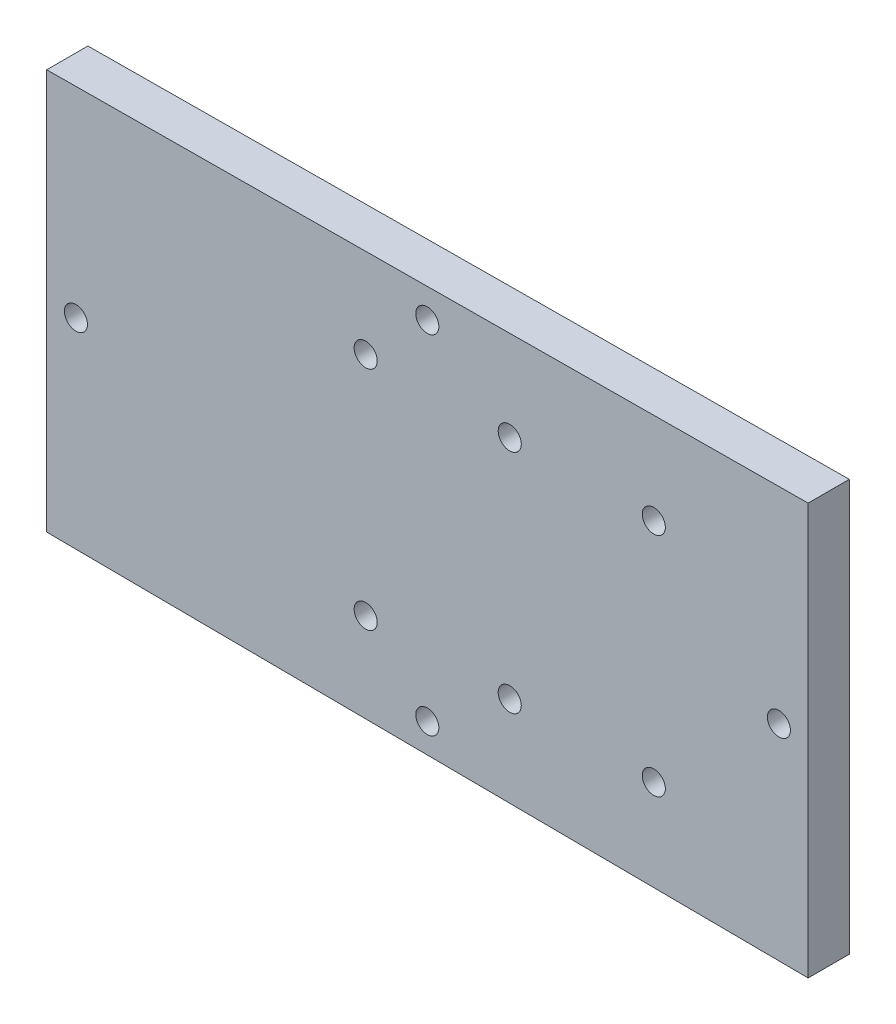
ISO-10303-21;
HEADER;
FILE_DESCRIPTION(('STEP AP214'),'2;1');
FILE_NAME('part.step','',(''),(''),'','','');
FILE_SCHEMA(('AUTOMOTIVE_DESIGN { 1 0 10303 214 1 1 1 1 }'));
ENDSEC;
DATA;
#1=APPLICATION_CONTEXT('core data for automotive mechanical design processes');
#2=APPLICATION_PROTOCOL_DEFINITION('international standard','automotive_design',2000,#1);
#3=PRODUCT_CONTEXT('',#1,'mechanical');
#4=PRODUCT('Part','Part','',(#3));
#5=PRODUCT_RELATED_PRODUCT_CATEGORY('part','',(#4));
#6=PRODUCT_DEFINITION_FORMATION('','',#4);
#7=PRODUCT_DEFINITION_CONTEXT('part definition',#1,'design');
#8=PRODUCT_DEFINITION('design','',#6,#7);
#9=PRODUCT_DEFINITION_SHAPE('','',#8);
#10=(LENGTH_UNIT() NAMED_UNIT(*) SI_UNIT(.MILLI.,.METRE.));
#11=(NAMED_UNIT(*) PLANE_ANGLE_UNIT() SI_UNIT($,.RADIAN.));
#12=(NAMED_UNIT(*) SI_UNIT($,.STERADIAN.) SOLID_ANGLE_UNIT());
#13=UNCERTAINTY_MEASURE_WITH_UNIT(LENGTH_MEASURE(1.E-05),#10,'distance_accuracy_value','');
#14=(GEOMETRIC_REPRESENTATION_CONTEXT(3) GLOBAL_UNCERTAINTY_ASSIGNED_CONTEXT((#13)) GLOBAL_UNIT_ASSIGNED_CONTEXT((#10,
#11,#12)) REPRESENTATION_CONTEXT('',''));
#15=CARTESIAN_POINT('',(0.,0.,0.));
#16=DIRECTION('',(0.,0.,1.));
#17=DIRECTION('',(1.,0.,0.));
#18=AXIS2_PLACEMENT_3D('',#15,#16,#17);
#19=CARTESIAN_POINT('',(0.,126.90875376903,25.4));
#20=DIRECTION('',(0.00713366924881035,-0.999974555057802,0.));
#21=DIRECTION('',(0.999974555057802,0.00713366924881035,0.));
#22=AXIS2_PLACEMENT_3D('',#19,#20,#21);
#23=PLANE('',#22);
#24=DIRECTION('',(-0.999974555057802,-0.00713366924881035,0.));
#25=VECTOR('',#24,1.);
#26=CARTESIAN_POINT('',(0.,126.90875376903,0.));
#27=LINE('',#26,#25);
#28=CARTESIAN_POINT('',(0.,126.90875376903,0.));
#29=VERTEX_POINT('',#28);
#30=CARTESIAN_POINT('',(-469.9,123.556557292569,0.));
#31=VERTEX_POINT('',#30);
#32=EDGE_CURVE('E101',#29,#31,#27,.T.);
#33=ORIENTED_EDGE('',*,*,#32,.T.);
#34=DIRECTION('',(0.,0.,-1.));
#35=VECTOR('',#34,1.);
#36=CARTESIAN_POINT('',(-469.9,123.556557292569,25.4));
#37=LINE('',#36,#35);
#38=CARTESIAN_POINT('',(-469.9,123.556557292569,25.4));
#39=VERTEX_POINT('',#38);
#40=EDGE_CURVE('E11',#39,#31,#37,.T.);
#41=ORIENTED_EDGE('',*,*,#40,.F.);
#42=DIRECTION('',(-0.999974555057802,-0.00713366924881035,0.));
#43=VECTOR('',#42,1.);
#44=CARTESIAN_POINT('',(0.,126.90875376903,25.4));
#45=LINE('',#44,#43);
#46=CARTESIAN_POINT('',(0.,126.90875376903,25.4));
#47=VERTEX_POINT('',#46);
#48=EDGE_CURVE('E87',#47,#39,#45,.T.);
#49=ORIENTED_EDGE('',*,*,#48,.F.);
#50=DIRECTION('',(0.,0.,-1.));
#51=VECTOR('',#50,1.);
#52=CARTESIAN_POINT('',(0.,126.90875376903,25.4));
#53=LINE('',#52,#51);
#54=EDGE_CURVE('E54',#47,#29,#53,.T.);
#55=ORIENTED_EDGE('',*,*,#54,.T.);
#56=EDGE_LOOP('',(#33,#41,#49,#55));
#57=FACE_BOUND('',#56,.T.);
#58=ADVANCED_FACE('F38',(#57),#23,.F.);
#59=CARTESIAN_POINT('',(-469.9,123.556557292569,25.4));
#60=DIRECTION('',(1.,0.,0.));
#61=DIRECTION('',(0.,1.,0.));
#62=AXIS2_PLACEMENT_3D('',#59,#60,#61);
#63=PLANE('',#62);
#64=DIRECTION('',(0.,-1.,0.));
#65=VECTOR('',#64,1.);
#66=CARTESIAN_POINT('',(-469.9,123.556557292569,0.));
#67=LINE('',#66,#65);
#68=CARTESIAN_POINT('',(-469.9,-123.556557292569,0.));
#69=VERTEX_POINT('',#68);
#70=EDGE_CURVE('E92',#31,#69,#67,.T.);
#71=ORIENTED_EDGE('',*,*,#70,.T.);
#72=DIRECTION('',(0.,0.,-1.));
#73=VECTOR('',#72,1.);
#74=CARTESIAN_POINT('',(-469.9,-123.556557292569,25.4));
#75=LINE('',#74,#73);
#76=CARTESIAN_POINT('',(-469.9,-123.556557292569,25.4));
#77=VERTEX_POINT('',#76);
#78=EDGE_CURVE('E46',#77,#69,#75,.T.);
#79=ORIENTED_EDGE('',*,*,#78,.F.);
#80=DIRECTION('',(0.,-1.,0.));
#81=VECTOR('',#80,1.);
#82=CARTESIAN_POINT('',(-469.9,123.556557292569,25.4));
#83=LINE('',#82,#81);
#84=EDGE_CURVE('E79',#39,#77,#83,.T.);
#85=ORIENTED_EDGE('',*,*,#84,.F.);
#86=ORIENTED_EDGE('',*,*,#40,.T.);
#87=EDGE_LOOP('',(#71,#79,#85,#86));
#88=FACE_BOUND('',#87,.T.);
#89=ADVANCED_FACE('F91',(#88),#63,.F.);
#90=CARTESIAN_POINT('',(0.,-126.90875376903,25.4));
#91=DIRECTION('',(-0.00713366924880988,-0.999974555057802,0.));
#92=DIRECTION('',(0.999974555057802,-0.00713366924880988,0.));
#93=AXIS2_PLACEMENT_3D('',#90,#91,#92);
#94=PLANE('',#93);
#95=DIRECTION('',(-0.999974555057802,0.00713366924880988,0.));
#96=VECTOR('',#95,1.);
#97=CARTESIAN_POINT('',(0.,-126.90875376903,0.));
#98=LINE('',#97,#96);
#99=CARTESIAN_POINT('',(0.,-126.90875376903,0.));
#100=VERTEX_POINT('',#99);
#101=EDGE_CURVE('E105',#100,#69,#98,.T.);
#102=ORIENTED_EDGE('',*,*,#101,.F.);
#103=DIRECTION('',(0.,0.,-1.));
#104=VECTOR('',#103,1.);
#105=CARTESIAN_POINT('',(0.,-126.90875376903,25.4));
#106=LINE('',#105,#104);
#107=CARTESIAN_POINT('',(0.,-126.90875376903,25.4));
#108=VERTEX_POINT('',#107);
#109=EDGE_CURVE('E68',#108,#100,#106,.T.);
#110=ORIENTED_EDGE('',*,*,#109,.F.);
#111=DIRECTION('',(-0.999974555057802,0.00713366924880988,0.));
#112=VECTOR('',#111,1.);
#113=CARTESIAN_POINT('',(0.,-126.90875376903,25.4));
#114=LINE('',#113,#112);
#115=EDGE_CURVE('E86',#108,#77,#114,.T.);
#116=ORIENTED_EDGE('',*,*,#115,.T.);
#117=ORIENTED_EDGE('',*,*,#78,.T.);
#118=EDGE_LOOP('',(#102,#110,#116,#117));
#119=FACE_BOUND('',#118,.T.);
#120=ADVANCED_FACE('F95',(#119),#94,.T.);
#121=CARTESIAN_POINT('',(0.,126.90875376903,25.4));
#122=DIRECTION('',(1.,0.,0.));
#123=DIRECTION('',(0.,1.,0.));
#124=AXIS2_PLACEMENT_3D('',#121,#122,#123);
#125=PLANE('',#124);
#126=DIRECTION('',(0.,-1.,0.));
#127=VECTOR('',#126,1.);
#128=CARTESIAN_POINT('',(0.,126.90875376903,0.));
#129=LINE('',#128,#127);
#130=EDGE_CURVE('E107',#29,#100,#129,.T.);
#131=ORIENTED_EDGE('',*,*,#130,.F.);
#132=ORIENTED_EDGE('',*,*,#54,.F.);
#133=DIRECTION('',(0.,-1.,0.));
#134=VECTOR('',#133,1.);
#135=CARTESIAN_POINT('',(0.,126.90875376903,25.4));
#136=LINE('',#135,#134);
#137=EDGE_CURVE('E96',#47,#108,#136,.T.);
#138=ORIENTED_EDGE('',*,*,#137,.T.);
#139=ORIENTED_EDGE('',*,*,#109,.T.);
#140=EDGE_LOOP('',(#131,#132,#138,#139));
#141=FACE_BOUND('',#140,.T.);
#142=ADVANCED_FACE('F179',(#141),#125,.T.);
#143=CARTESIAN_POINT('',(0.,0.,25.4));
#144=DIRECTION('',(0.,0.,1.));
#145=DIRECTION('',(1.,0.,0.));
#146=AXIS2_PLACEMENT_3D('',#143,#144,#145);
#147=PLANE('',#146);
#148=CARTESIAN_POINT('',(-95.2499999999999,69.85,25.4));
#149=DIRECTION('',(0.,0.,1.));
#150=DIRECTION('',(1.,0.,0.));
#151=AXIS2_PLACEMENT_3D('',#148,#149,#150);
#152=CIRCLE('',#151,7.1247);
#153=CARTESIAN_POINT('',(-88.1252999999999,69.85,25.4));
#154=VERTEX_POINT('',#153);
#155=EDGE_CURVE('E164',#154,#154,#152,.T.);
#156=ORIENTED_EDGE('',*,*,#155,.F.);
#157=EDGE_LOOP('',(#156));
#158=FACE_BOUND('',#157,.T.);
#159=CARTESIAN_POINT('',(-184.15,69.85,25.4));
#160=DIRECTION('',(0.,0.,1.));
#161=DIRECTION('',(1.,0.,0.));
#162=AXIS2_PLACEMENT_3D('',#159,#160,#161);
#163=CIRCLE('',#162,7.1247);
#164=CARTESIAN_POINT('',(-177.0253,69.85,25.4));
#165=VERTEX_POINT('',#164);
#166=EDGE_CURVE('E158',#165,#165,#163,.T.);
#167=ORIENTED_EDGE('',*,*,#166,.F.);
#168=EDGE_LOOP('',(#167));
#169=FACE_BOUND('',#168,.T.);
#170=CARTESIAN_POINT('',(-273.05,69.85,25.4));
#171=DIRECTION('',(0.,0.,1.));
#172=DIRECTION('',(1.,0.,0.));
#173=AXIS2_PLACEMENT_3D('',#170,#171,#172);
#174=CIRCLE('',#173,7.1247);
#175=CARTESIAN_POINT('',(-265.9253,69.85,25.4));
#176=VERTEX_POINT('',#175);
#177=EDGE_CURVE('E152',#176,#176,#174,.T.);
#178=ORIENTED_EDGE('',*,*,#177,.F.);
#179=EDGE_LOOP('',(#178));
#180=FACE_BOUND('',#179,.T.);
#181=CARTESIAN_POINT('',(-95.2499999999999,-69.85,25.4));
#182=DIRECTION('',(0.,0.,1.));
#183=DIRECTION('',(1.,0.,0.));
#184=AXIS2_PLACEMENT_3D('',#181,#182,#183);
#185=CIRCLE('',#184,7.1247);
#186=CARTESIAN_POINT('',(-88.1252999999999,-69.85,25.4));
#187=VERTEX_POINT('',#186);
#188=EDGE_CURVE('E146',#187,#187,#185,.T.);
#189=ORIENTED_EDGE('',*,*,#188,.F.);
#190=EDGE_LOOP('',(#189));
#191=FACE_BOUND('',#190,.T.);
#192=CARTESIAN_POINT('',(-184.15,-69.85,25.4));
#193=DIRECTION('',(0.,0.,1.));
#194=DIRECTION('',(1.,0.,0.));
#195=AXIS2_PLACEMENT_3D('',#192,#193,#194);
#196=CIRCLE('',#195,7.12470000000003);
#197=CARTESIAN_POINT('',(-177.0253,-69.85,25.4));
#198=VERTEX_POINT('',#197);
#199=EDGE_CURVE('E140',#198,#198,#196,.T.);
#200=ORIENTED_EDGE('',*,*,#199,.F.);
#201=EDGE_LOOP('',(#200));
#202=FACE_BOUND('',#201,.T.);
#203=CARTESIAN_POINT('',(-273.05,-69.85,25.4));
#204=DIRECTION('',(0.,0.,1.));
#205=DIRECTION('',(1.,0.,0.));
#206=AXIS2_PLACEMENT_3D('',#203,#204,#205);
#207=CIRCLE('',#206,7.1247);
#208=CARTESIAN_POINT('',(-265.9253,-69.85,25.4));
#209=VERTEX_POINT('',#208);
#210=EDGE_CURVE('E134',#209,#209,#207,.T.);
#211=ORIENTED_EDGE('',*,*,#210,.F.);
#212=EDGE_LOOP('',(#211));
#213=FACE_BOUND('',#212,.T.);
#214=CARTESIAN_POINT('',(-235.026595281803,-107.200076916086,25.4));
#215=DIRECTION('',(0.,0.,1.));
#216=DIRECTION('',(1.,0.,0.));
#217=AXIS2_PLACEMENT_3D('',#214,#215,#216);
#218=CIRCLE('',#217,7.1247);
#219=CARTESIAN_POINT('',(-227.901895281803,-107.200076916086,25.4));
#220=VERTEX_POINT('',#219);
#221=EDGE_CURVE('E128',#220,#220,#218,.T.);
#222=ORIENTED_EDGE('',*,*,#221,.F.);
#223=EDGE_LOOP('',(#222));
#224=FACE_BOUND('',#223,.T.);
#225=CARTESIAN_POINT('',(-451.866,0.,25.4));
#226=DIRECTION('',(0.,0.,1.));
#227=DIRECTION('',(1.,0.,0.));
#228=AXIS2_PLACEMENT_3D('',#225,#226,#227);
#229=CIRCLE('',#228,7.1247);
#230=CARTESIAN_POINT('',(-444.7413,0.,25.4));
#231=VERTEX_POINT('',#230);
#232=EDGE_CURVE('E122',#231,#231,#229,.T.);
#233=ORIENTED_EDGE('',*,*,#232,.F.);
#234=EDGE_LOOP('',(#233));
#235=FACE_BOUND('',#234,.T.);
#236=CARTESIAN_POINT('',(-18.034,0.,25.4));
#237=DIRECTION('',(0.,0.,1.));
#238=DIRECTION('',(1.,0.,0.));
#239=AXIS2_PLACEMENT_3D('',#236,#237,#238);
#240=CIRCLE('',#239,7.1247);
#241=CARTESIAN_POINT('',(-10.9093,0.,25.4));
#242=VERTEX_POINT('',#241);
#243=EDGE_CURVE('E116',#242,#242,#240,.T.);
#244=ORIENTED_EDGE('',*,*,#243,.F.);
#245=EDGE_LOOP('',(#244));
#246=FACE_BOUND('',#245,.T.);
#247=CARTESIAN_POINT('',(-235.026595281803,107.199301857,25.4));
#248=DIRECTION('',(0.,0.,1.));
#249=DIRECTION('',(1.,0.,0.));
#250=AXIS2_PLACEMENT_3D('',#247,#248,#249);
#251=CIRCLE('',#250,7.1247);
#252=CARTESIAN_POINT('',(-227.901895281803,107.199301857,25.4));
#253=VERTEX_POINT('',#252);
#254=EDGE_CURVE('E103',#253,#253,#251,.T.);
#255=ORIENTED_EDGE('',*,*,#254,.F.);
#256=EDGE_LOOP('',(#255));
#257=FACE_BOUND('',#256,.T.);
#258=ORIENTED_EDGE('',*,*,#48,.T.);
#259=ORIENTED_EDGE('',*,*,#84,.T.);
#260=ORIENTED_EDGE('',*,*,#115,.F.);
#261=ORIENTED_EDGE('',*,*,#137,.F.);
#262=EDGE_LOOP('',(#258,#259,#260,#261));
#263=FACE_BOUND('',#262,.T.);
#264=ADVANCED_FACE('F83',(#158,#169,#180,#191,#202,#213,#224,#235,#246,#257,#263),#147,.T.);
#265=CARTESIAN_POINT('',(0.,0.,0.));
#266=DIRECTION('',(0.,0.,1.));
#267=DIRECTION('',(1.,0.,0.));
#268=AXIS2_PLACEMENT_3D('',#265,#266,#267);
#269=PLANE('',#268);
#270=CARTESIAN_POINT('',(-95.2499999999999,69.85,0.));
#271=DIRECTION('',(0.,0.,1.));
#272=DIRECTION('',(1.,0.,0.));
#273=AXIS2_PLACEMENT_3D('',#270,#271,#272);
#274=CIRCLE('',#273,7.1247);
#275=CARTESIAN_POINT('',(-88.1252999999999,69.85,0.));
#276=VERTEX_POINT('',#275);
#277=EDGE_CURVE('E167',#276,#276,#274,.T.);
#278=ORIENTED_EDGE('',*,*,#277,.T.);
#279=EDGE_LOOP('',(#278));
#280=FACE_BOUND('',#279,.T.);
#281=CARTESIAN_POINT('',(-184.15,69.85,0.));
#282=DIRECTION('',(0.,0.,1.));
#283=DIRECTION('',(1.,0.,0.));
#284=AXIS2_PLACEMENT_3D('',#281,#282,#283);
#285=CIRCLE('',#284,7.1247);
#286=CARTESIAN_POINT('',(-177.0253,69.85,0.));
#287=VERTEX_POINT('',#286);
#288=EDGE_CURVE('E161',#287,#287,#285,.T.);
#289=ORIENTED_EDGE('',*,*,#288,.T.);
#290=EDGE_LOOP('',(#289));
#291=FACE_BOUND('',#290,.T.);
#292=CARTESIAN_POINT('',(-273.05,69.85,0.));
#293=DIRECTION('',(0.,0.,1.));
#294=DIRECTION('',(1.,0.,0.));
#295=AXIS2_PLACEMENT_3D('',#292,#293,#294);
#296=CIRCLE('',#295,7.1247);
#297=CARTESIAN_POINT('',(-265.9253,69.85,0.));
#298=VERTEX_POINT('',#297);
#299=EDGE_CURVE('E155',#298,#298,#296,.T.);
#300=ORIENTED_EDGE('',*,*,#299,.T.);
#301=EDGE_LOOP('',(#300));
#302=FACE_BOUND('',#301,.T.);
#303=CARTESIAN_POINT('',(-95.2499999999999,-69.85,0.));
#304=DIRECTION('',(0.,0.,1.));
#305=DIRECTION('',(1.,0.,0.));
#306=AXIS2_PLACEMENT_3D('',#303,#304,#305);
#307=CIRCLE('',#306,7.1247);
#308=CARTESIAN_POINT('',(-88.1252999999999,-69.85,0.));
#309=VERTEX_POINT('',#308);
#310=EDGE_CURVE('E149',#309,#309,#307,.T.);
#311=ORIENTED_EDGE('',*,*,#310,.T.);
#312=EDGE_LOOP('',(#311));
#313=FACE_BOUND('',#312,.T.);
#314=CARTESIAN_POINT('',(-184.15,-69.85,0.));
#315=DIRECTION('',(0.,0.,1.));
#316=DIRECTION('',(1.,0.,0.));
#317=AXIS2_PLACEMENT_3D('',#314,#315,#316);
#318=CIRCLE('',#317,7.12470000000003);
#319=CARTESIAN_POINT('',(-177.0253,-69.85,0.));
#320=VERTEX_POINT('',#319);
#321=EDGE_CURVE('E143',#320,#320,#318,.T.);
#322=ORIENTED_EDGE('',*,*,#321,.T.);
#323=EDGE_LOOP('',(#322));
#324=FACE_BOUND('',#323,.T.);
#325=CARTESIAN_POINT('',(-273.05,-69.85,0.));
#326=DIRECTION('',(0.,0.,1.));
#327=DIRECTION('',(1.,0.,0.));
#328=AXIS2_PLACEMENT_3D('',#325,#326,#327);
#329=CIRCLE('',#328,7.1247);
#330=CARTESIAN_POINT('',(-265.9253,-69.85,0.));
#331=VERTEX_POINT('',#330);
#332=EDGE_CURVE('E137',#331,#331,#329,.T.);
#333=ORIENTED_EDGE('',*,*,#332,.T.);
#334=EDGE_LOOP('',(#333));
#335=FACE_BOUND('',#334,.T.);
#336=CARTESIAN_POINT('',(-235.026595281803,-107.200076916086,0.));
#337=DIRECTION('',(0.,0.,1.));
#338=DIRECTION('',(1.,0.,0.));
#339=AXIS2_PLACEMENT_3D('',#336,#337,#338);
#340=CIRCLE('',#339,7.1247);
#341=CARTESIAN_POINT('',(-227.901895281803,-107.200076916086,0.));
#342=VERTEX_POINT('',#341);
#343=EDGE_CURVE('E131',#342,#342,#340,.T.);
#344=ORIENTED_EDGE('',*,*,#343,.T.);
#345=EDGE_LOOP('',(#344));
#346=FACE_BOUND('',#345,.T.);
#347=CARTESIAN_POINT('',(-451.866,0.,0.));
#348=DIRECTION('',(0.,0.,1.));
#349=DIRECTION('',(1.,0.,0.));
#350=AXIS2_PLACEMENT_3D('',#347,#348,#349);
#351=CIRCLE('',#350,7.1247);
#352=CARTESIAN_POINT('',(-444.7413,0.,0.));
#353=VERTEX_POINT('',#352);
#354=EDGE_CURVE('E125',#353,#353,#351,.T.);
#355=ORIENTED_EDGE('',*,*,#354,.T.);
#356=EDGE_LOOP('',(#355));
#357=FACE_BOUND('',#356,.T.);
#358=CARTESIAN_POINT('',(-18.034,0.,0.));
#359=DIRECTION('',(0.,0.,1.));
#360=DIRECTION('',(1.,0.,0.));
#361=AXIS2_PLACEMENT_3D('',#358,#359,#360);
#362=CIRCLE('',#361,7.1247);
#363=CARTESIAN_POINT('',(-10.9093,0.,0.));
#364=VERTEX_POINT('',#363);
#365=EDGE_CURVE('E119',#364,#364,#362,.T.);
#366=ORIENTED_EDGE('',*,*,#365,.T.);
#367=EDGE_LOOP('',(#366));
#368=FACE_BOUND('',#367,.T.);
#369=CARTESIAN_POINT('',(-235.026595281803,107.199301857,0.));
#370=DIRECTION('',(0.,0.,1.));
#371=DIRECTION('',(1.,0.,0.));
#372=AXIS2_PLACEMENT_3D('',#369,#370,#371);
#373=CIRCLE('',#372,7.1247);
#374=CARTESIAN_POINT('',(-227.901895281803,107.199301857,0.));
#375=VERTEX_POINT('',#374);
#376=EDGE_CURVE('E113',#375,#375,#373,.T.);
#377=ORIENTED_EDGE('',*,*,#376,.T.);
#378=EDGE_LOOP('',(#377));
#379=FACE_BOUND('',#378,.T.);
#380=ORIENTED_EDGE('',*,*,#32,.F.);
#381=ORIENTED_EDGE('',*,*,#130,.T.);
#382=ORIENTED_EDGE('',*,*,#101,.T.);
#383=ORIENTED_EDGE('',*,*,#70,.F.);
#384=EDGE_LOOP('',(#380,#381,#382,#383));
#385=FACE_BOUND('',#384,.T.);
#386=ADVANCED_FACE('F178',(#280,#291,#302,#313,#324,#335,#346,#357,#368,#379,#385),#269,.F.);
#387=CARTESIAN_POINT('',(-235.026595281803,107.199301857,25.4));
#388=DIRECTION('',(0.,0.,-1.));
#389=DIRECTION('',(-1.,0.,0.));
#390=AXIS2_PLACEMENT_3D('',#387,#388,#389);
#391=CYLINDRICAL_SURFACE('',#390,7.1247);
#392=ORIENTED_EDGE('',*,*,#254,.T.);
#393=EDGE_LOOP('',(#392));
#394=FACE_BOUND('',#393,.T.);
#395=ORIENTED_EDGE('',*,*,#376,.F.);
#396=EDGE_LOOP('',(#395));
#397=FACE_BOUND('',#396,.T.);
#398=ADVANCED_FACE('F199',(#394,#397),#391,.F.);
#399=CARTESIAN_POINT('',(-18.034,0.,25.4));
#400=DIRECTION('',(0.,0.,-1.));
#401=DIRECTION('',(-1.,0.,0.));
#402=AXIS2_PLACEMENT_3D('',#399,#400,#401);
#403=CYLINDRICAL_SURFACE('',#402,7.1247);
#404=ORIENTED_EDGE('',*,*,#243,.T.);
#405=EDGE_LOOP('',(#404));
#406=FACE_BOUND('',#405,.T.);
#407=ORIENTED_EDGE('',*,*,#365,.F.);
#408=EDGE_LOOP('',(#407));
#409=FACE_BOUND('',#408,.T.);
#410=ADVANCED_FACE('F202',(#406,#409),#403,.F.);
#411=CARTESIAN_POINT('',(-451.866,0.,25.4));
#412=DIRECTION('',(0.,0.,-1.));
#413=DIRECTION('',(-1.,0.,0.));
#414=AXIS2_PLACEMENT_3D('',#411,#412,#413);
#415=CYLINDRICAL_SURFACE('',#414,7.1247);
#416=ORIENTED_EDGE('',*,*,#232,.T.);
#417=EDGE_LOOP('',(#416));
#418=FACE_BOUND('',#417,.T.);
#419=ORIENTED_EDGE('',*,*,#354,.F.);
#420=EDGE_LOOP('',(#419));
#421=FACE_BOUND('',#420,.T.);
#422=ADVANCED_FACE('F253',(#418,#421),#415,.F.);
#423=CARTESIAN_POINT('',(-235.026595281803,-107.200076916086,25.4));
#424=DIRECTION('',(0.,0.,-1.));
#425=DIRECTION('',(-1.,0.,0.));
#426=AXIS2_PLACEMENT_3D('',#423,#424,#425);
#427=CYLINDRICAL_SURFACE('',#426,7.1247);
#428=ORIENTED_EDGE('',*,*,#221,.T.);
#429=EDGE_LOOP('',(#428));
#430=FACE_BOUND('',#429,.T.);
#431=ORIENTED_EDGE('',*,*,#343,.F.);
#432=EDGE_LOOP('',(#431));
#433=FACE_BOUND('',#432,.T.);
#434=ADVANCED_FACE('F263',(#430,#433),#427,.F.);
#435=CARTESIAN_POINT('',(-273.05,-69.85,25.4));
#436=DIRECTION('',(0.,0.,-1.));
#437=DIRECTION('',(-1.,0.,0.));
#438=AXIS2_PLACEMENT_3D('',#435,#436,#437);
#439=CYLINDRICAL_SURFACE('',#438,7.1247);
#440=ORIENTED_EDGE('',*,*,#210,.T.);
#441=EDGE_LOOP('',(#440));
#442=FACE_BOUND('',#441,.T.);
#443=ORIENTED_EDGE('',*,*,#332,.F.);
#444=EDGE_LOOP('',(#443));
#445=FACE_BOUND('',#444,.T.);
#446=ADVANCED_FACE('F273',(#442,#445),#439,.F.);
#447=CARTESIAN_POINT('',(-184.15,-69.85,25.4));
#448=DIRECTION('',(0.,0.,-1.));
#449=DIRECTION('',(-1.,0.,0.));
#450=AXIS2_PLACEMENT_3D('',#447,#448,#449);
#451=CYLINDRICAL_SURFACE('',#450,7.12470000000003);
#452=ORIENTED_EDGE('',*,*,#199,.T.);
#453=EDGE_LOOP('',(#452));
#454=FACE_BOUND('',#453,.T.);
#455=ORIENTED_EDGE('',*,*,#321,.F.);
#456=EDGE_LOOP('',(#455));
#457=FACE_BOUND('',#456,.T.);
#458=ADVANCED_FACE('F283',(#454,#457),#451,.F.);
#459=CARTESIAN_POINT('',(-95.2499999999999,-69.85,25.4));
#460=DIRECTION('',(0.,0.,-1.));
#461=DIRECTION('',(-1.,0.,0.));
#462=AXIS2_PLACEMENT_3D('',#459,#460,#461);
#463=CYLINDRICAL_SURFACE('',#462,7.1247);
#464=ORIENTED_EDGE('',*,*,#188,.T.);
#465=EDGE_LOOP('',(#464));
#466=FACE_BOUND('',#465,.T.);
#467=ORIENTED_EDGE('',*,*,#310,.F.);
#468=EDGE_LOOP('',(#467));
#469=FACE_BOUND('',#468,.T.);
#470=ADVANCED_FACE('F293',(#466,#469),#463,.F.);
#471=CARTESIAN_POINT('',(-273.05,69.85,25.4));
#472=DIRECTION('',(0.,0.,-1.));
#473=DIRECTION('',(-1.,0.,0.));
#474=AXIS2_PLACEMENT_3D('',#471,#472,#473);
#475=CYLINDRICAL_SURFACE('',#474,7.1247);
#476=ORIENTED_EDGE('',*,*,#177,.T.);
#477=EDGE_LOOP('',(#476));
#478=FACE_BOUND('',#477,.T.);
#479=ORIENTED_EDGE('',*,*,#299,.F.);
#480=EDGE_LOOP('',(#479));
#481=FACE_BOUND('',#480,.T.);
#482=ADVANCED_FACE('F303',(#478,#481),#475,.F.);
#483=CARTESIAN_POINT('',(-184.15,69.85,25.4));
#484=DIRECTION('',(0.,0.,-1.));
#485=DIRECTION('',(-1.,0.,0.));
#486=AXIS2_PLACEMENT_3D('',#483,#484,#485);
#487=CYLINDRICAL_SURFACE('',#486,7.1247);
#488=ORIENTED_EDGE('',*,*,#166,.T.);
#489=EDGE_LOOP('',(#488));
#490=FACE_BOUND('',#489,.T.);
#491=ORIENTED_EDGE('',*,*,#288,.F.);
#492=EDGE_LOOP('',(#491));
#493=FACE_BOUND('',#492,.T.);
#494=ADVANCED_FACE('F313',(#490,#493),#487,.F.);
#495=CARTESIAN_POINT('',(-95.2499999999999,69.85,25.4));
#496=DIRECTION('',(0.,0.,-1.));
#497=DIRECTION('',(-1.,0.,0.));
#498=AXIS2_PLACEMENT_3D('',#495,#496,#497);
#499=CYLINDRICAL_SURFACE('',#498,7.1247);
#500=ORIENTED_EDGE('',*,*,#155,.T.);
#501=EDGE_LOOP('',(#500));
#502=FACE_BOUND('',#501,.T.);
#503=ORIENTED_EDGE('',*,*,#277,.F.);
#504=EDGE_LOOP('',(#503));
#505=FACE_BOUND('',#504,.T.);
#506=ADVANCED_FACE('F173',(#502,#505),#499,.F.);
#507=CLOSED_SHELL('',(#58,#89,#120,#142,#264,#386,#398,#410,#422,#434,#446,#458,#470,#482,#494,#506));
#508=MANIFOLD_SOLID_BREP('B2',#507);
#509=ADVANCED_BREP_SHAPE_REPRESENTATION('',(#18,#508),#14);
#510=SHAPE_DEFINITION_REPRESENTATION(#9,#509);
ENDSEC;
END-ISO-10303-21;
